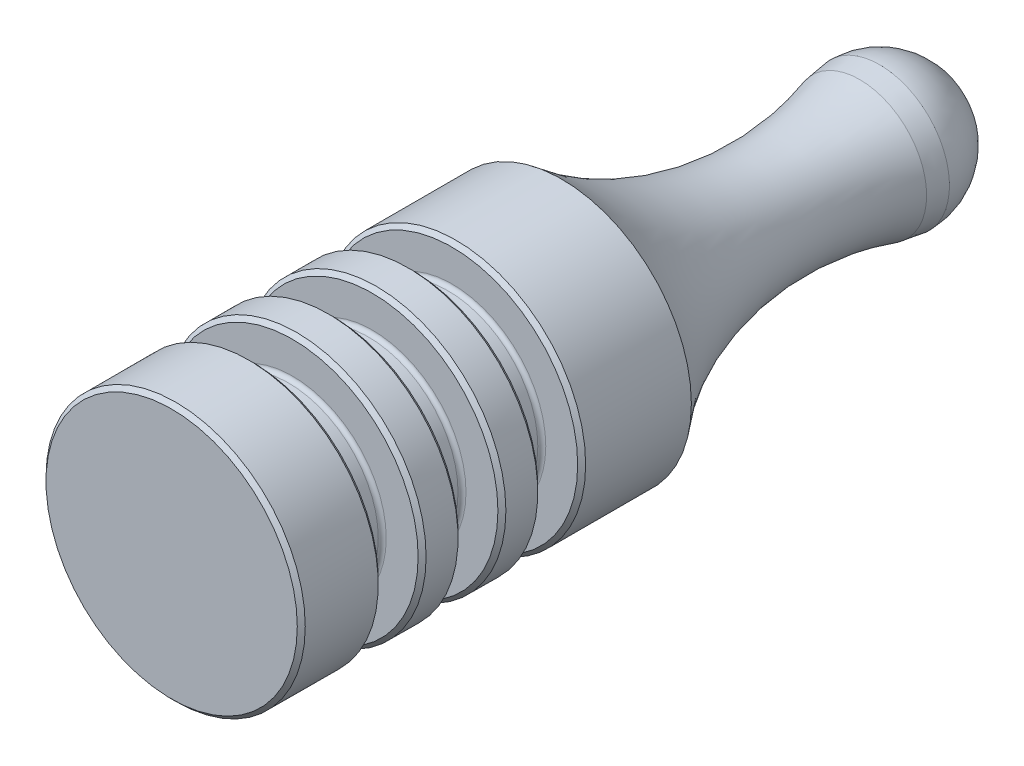
ISO-10303-21;
HEADER;
FILE_DESCRIPTION(('STEP AP214'),'2;1');
FILE_NAME('part.step','',(''),(''),'','','');
FILE_SCHEMA(('AUTOMOTIVE_DESIGN { 1 0 10303 214 1 1 1 1 }'));
ENDSEC;
DATA;
#1=APPLICATION_CONTEXT('core data for automotive mechanical design processes');
#2=APPLICATION_PROTOCOL_DEFINITION('international standard','automotive_design',2000,#1);
#3=PRODUCT_CONTEXT('',#1,'mechanical');
#4=PRODUCT('Part','Part','',(#3));
#5=PRODUCT_RELATED_PRODUCT_CATEGORY('part','',(#4));
#6=PRODUCT_DEFINITION_FORMATION('','',#4);
#7=PRODUCT_DEFINITION_CONTEXT('part definition',#1,'design');
#8=PRODUCT_DEFINITION('design','',#6,#7);
#9=PRODUCT_DEFINITION_SHAPE('','',#8);
#10=(LENGTH_UNIT() NAMED_UNIT(*) SI_UNIT(.MILLI.,.METRE.));
#11=(NAMED_UNIT(*) PLANE_ANGLE_UNIT() SI_UNIT($,.RADIAN.));
#12=(NAMED_UNIT(*) SI_UNIT($,.STERADIAN.) SOLID_ANGLE_UNIT());
#13=UNCERTAINTY_MEASURE_WITH_UNIT(LENGTH_MEASURE(1.E-05),#10,'distance_accuracy_value','');
#14=(GEOMETRIC_REPRESENTATION_CONTEXT(3) GLOBAL_UNCERTAINTY_ASSIGNED_CONTEXT((#13)) GLOBAL_UNIT_ASSIGNED_CONTEXT((#10,
#11,#12)) REPRESENTATION_CONTEXT('',''));
#15=CARTESIAN_POINT('',(0.,0.,0.));
#16=DIRECTION('',(0.,0.,1.));
#17=DIRECTION('',(1.,0.,0.));
#18=AXIS2_PLACEMENT_3D('',#15,#16,#17);
#19=CARTESIAN_POINT('',(0.,0.,35.5));
#20=DIRECTION('',(0.,0.,-1.));
#21=DIRECTION('',(-1.,0.,0.));
#22=AXIS2_PLACEMENT_3D('',#19,#20,#21);
#23=CYLINDRICAL_SURFACE('',#22,6.5);
#24=CARTESIAN_POINT('',(0.,0.,21.24));
#25=DIRECTION('',(0.,0.,1.));
#26=DIRECTION('',(1.,0.,0.));
#27=AXIS2_PLACEMENT_3D('',#24,#25,#26);
#28=CIRCLE('',#27,6.5);
#29=CARTESIAN_POINT('',(6.5,0.,21.24));
#30=VERTEX_POINT('',#29);
#31=EDGE_CURVE('E123',#30,#30,#28,.F.);
#32=ORIENTED_EDGE('',*,*,#31,.T.);
#33=EDGE_LOOP('',(#32));
#34=FACE_BOUND('',#33,.T.);
#35=CARTESIAN_POINT('',(0.,0.,15.94));
#36=DIRECTION('',(0.,0.,1.));
#37=DIRECTION('',(1.,0.,0.));
#38=AXIS2_PLACEMENT_3D('',#35,#36,#37);
#39=CIRCLE('',#38,6.5);
#40=CARTESIAN_POINT('',(6.5,0.,15.94));
#41=VERTEX_POINT('',#40);
#42=EDGE_CURVE('E132',#41,#41,#39,.T.);
#43=ORIENTED_EDGE('',*,*,#42,.T.);
#44=EDGE_LOOP('',(#43));
#45=FACE_BOUND('',#44,.T.);
#46=ADVANCED_FACE('F42',(#34,#45),#23,.T.);
#47=CARTESIAN_POINT('',(0.,0.,31.64));
#48=DIRECTION('',(0.,0.,-1.));
#49=DIRECTION('',(-1.,0.,0.));
#50=AXIS2_PLACEMENT_3D('',#47,#48,#49);
#51=CIRCLE('',#50,6.5);
#52=CARTESIAN_POINT('',(-6.5,0.,31.64));
#53=VERTEX_POINT('',#52);
#54=EDGE_CURVE('E92',#53,#53,#51,.F.);
#55=ORIENTED_EDGE('',*,*,#54,.T.);
#56=EDGE_LOOP('',(#55));
#57=FACE_BOUND('',#56,.T.);
#58=CARTESIAN_POINT('',(0.,0.,35.3));
#59=DIRECTION('',(0.,0.,1.));
#60=DIRECTION('',(1.,0.,0.));
#61=AXIS2_PLACEMENT_3D('',#58,#59,#60);
#62=CIRCLE('',#61,6.5);
#63=CARTESIAN_POINT('',(6.5,0.,35.3));
#64=VERTEX_POINT('',#63);
#65=EDGE_CURVE('E95',#64,#64,#62,.F.);
#66=ORIENTED_EDGE('',*,*,#65,.T.);
#67=EDGE_LOOP('',(#66));
#68=FACE_BOUND('',#67,.T.);
#69=ADVANCED_FACE('F155',(#57,#68),#23,.T.);
#70=CARTESIAN_POINT('',(0.,0.,35.5));
#71=DIRECTION('',(0.,0.,1.));
#72=DIRECTION('',(1.,0.,0.));
#73=AXIS2_PLACEMENT_3D('',#70,#71,#72);
#74=PLANE('',#73);
#75=CARTESIAN_POINT('',(0.,0.,35.5));
#76=DIRECTION('',(0.,0.,1.));
#77=DIRECTION('',(1.,0.,0.));
#78=AXIS2_PLACEMENT_3D('',#75,#76,#77);
#79=CIRCLE('',#78,6.3);
#80=CARTESIAN_POINT('',(6.3,0.,35.5));
#81=VERTEX_POINT('',#80);
#82=EDGE_CURVE('E86',#81,#81,#79,.T.);
#83=ORIENTED_EDGE('',*,*,#82,.T.);
#84=EDGE_LOOP('',(#83));
#85=FACE_BOUND('',#84,.T.);
#86=ADVANCED_FACE('F162',(#85),#74,.T.);
#87=CARTESIAN_POINT('',(0.,6.5,31.44));
#88=DIRECTION('',(0.,0.,-1.));
#89=DIRECTION('',(-1.,0.,0.));
#90=AXIS2_PLACEMENT_3D('',#87,#88,#89);
#91=PLANE('',#90);
#92=CARTESIAN_POINT('',(0.,0.,31.44));
#93=DIRECTION('',(0.,0.,-1.));
#94=DIRECTION('',(-1.,0.,0.));
#95=AXIS2_PLACEMENT_3D('',#92,#93,#94);
#96=CIRCLE('',#95,4.7);
#97=CARTESIAN_POINT('',(-4.7,0.,31.44));
#98=VERTEX_POINT('',#97);
#99=EDGE_CURVE('E10',#98,#98,#96,.F.);
#100=ORIENTED_EDGE('',*,*,#99,.T.);
#101=EDGE_LOOP('',(#100));
#102=FACE_BOUND('',#101,.T.);
#103=CARTESIAN_POINT('',(0.,0.,31.44));
#104=DIRECTION('',(0.,0.,-1.));
#105=DIRECTION('',(-1.,0.,0.));
#106=AXIS2_PLACEMENT_3D('',#103,#104,#105);
#107=CIRCLE('',#106,6.3);
#108=CARTESIAN_POINT('',(-6.3,0.,31.44));
#109=VERTEX_POINT('',#108);
#110=EDGE_CURVE('E89',#109,#109,#107,.T.);
#111=ORIENTED_EDGE('',*,*,#110,.T.);
#112=EDGE_LOOP('',(#111));
#113=FACE_BOUND('',#112,.T.);
#114=ADVANCED_FACE('F266',(#102,#113),#91,.T.);
#115=CARTESIAN_POINT('',(0.,0.,35.5));
#116=DIRECTION('',(0.,0.,1.));
#117=DIRECTION('',(1.,0.,0.));
#118=AXIS2_PLACEMENT_3D('',#115,#116,#117);
#119=CYLINDRICAL_SURFACE('',#118,4.5);
#120=CARTESIAN_POINT('',(0.,0.,29.64));
#121=DIRECTION('',(0.,0.,1.));
#122=DIRECTION('',(1.,0.,0.));
#123=AXIS2_PLACEMENT_3D('',#120,#121,#122);
#124=CIRCLE('',#123,4.5);
#125=CARTESIAN_POINT('',(4.5,0.,29.64));
#126=VERTEX_POINT('',#125);
#127=EDGE_CURVE('E62',#126,#126,#124,.T.);
#128=ORIENTED_EDGE('',*,*,#127,.T.);
#129=EDGE_LOOP('',(#128));
#130=FACE_BOUND('',#129,.T.);
#131=CARTESIAN_POINT('',(0.,0.,31.24));
#132=DIRECTION('',(0.,0.,-1.));
#133=DIRECTION('',(-1.,0.,0.));
#134=AXIS2_PLACEMENT_3D('',#131,#132,#133);
#135=CIRCLE('',#134,4.5);
#136=CARTESIAN_POINT('',(-4.5,0.,31.24));
#137=VERTEX_POINT('',#136);
#138=EDGE_CURVE('E65',#137,#137,#135,.T.);
#139=ORIENTED_EDGE('',*,*,#138,.T.);
#140=EDGE_LOOP('',(#139));
#141=FACE_BOUND('',#140,.T.);
#142=ADVANCED_FACE('F177',(#130,#141),#119,.T.);
#143=CARTESIAN_POINT('',(0.,6.5,29.44));
#144=DIRECTION('',(0.,0.,1.));
#145=DIRECTION('',(1.,0.,0.));
#146=AXIS2_PLACEMENT_3D('',#143,#144,#145);
#147=PLANE('',#146);
#148=CARTESIAN_POINT('',(0.,0.,29.44));
#149=DIRECTION('',(0.,0.,1.));
#150=DIRECTION('',(1.,0.,0.));
#151=AXIS2_PLACEMENT_3D('',#148,#149,#150);
#152=CIRCLE('',#151,4.7);
#153=CARTESIAN_POINT('',(4.7,0.,29.44));
#154=VERTEX_POINT('',#153);
#155=EDGE_CURVE('E57',#154,#154,#152,.F.);
#156=ORIENTED_EDGE('',*,*,#155,.T.);
#157=EDGE_LOOP('',(#156));
#158=FACE_BOUND('',#157,.T.);
#159=CARTESIAN_POINT('',(0.,0.,29.44));
#160=DIRECTION('',(0.,0.,1.));
#161=DIRECTION('',(1.,0.,0.));
#162=AXIS2_PLACEMENT_3D('',#159,#160,#161);
#163=CIRCLE('',#162,6.3);
#164=CARTESIAN_POINT('',(6.3,0.,29.44));
#165=VERTEX_POINT('',#164);
#166=EDGE_CURVE('E99',#165,#165,#163,.T.);
#167=ORIENTED_EDGE('',*,*,#166,.T.);
#168=EDGE_LOOP('',(#167));
#169=FACE_BOUND('',#168,.T.);
#170=ADVANCED_FACE('F169',(#158,#169),#147,.T.);
#171=CARTESIAN_POINT('',(0.,0.,27.64));
#172=DIRECTION('',(0.,0.,-1.));
#173=DIRECTION('',(-1.,0.,0.));
#174=AXIS2_PLACEMENT_3D('',#171,#172,#173);
#175=CIRCLE('',#174,6.5);
#176=CARTESIAN_POINT('',(-6.5,0.,27.64));
#177=VERTEX_POINT('',#176);
#178=EDGE_CURVE('E105',#177,#177,#175,.F.);
#179=ORIENTED_EDGE('',*,*,#178,.T.);
#180=EDGE_LOOP('',(#179));
#181=FACE_BOUND('',#180,.T.);
#182=CARTESIAN_POINT('',(0.,0.,29.24));
#183=DIRECTION('',(0.,0.,1.));
#184=DIRECTION('',(1.,0.,0.));
#185=AXIS2_PLACEMENT_3D('',#182,#183,#184);
#186=CIRCLE('',#185,6.5);
#187=CARTESIAN_POINT('',(6.5,0.,29.24));
#188=VERTEX_POINT('',#187);
#189=EDGE_CURVE('E108',#188,#188,#186,.F.);
#190=ORIENTED_EDGE('',*,*,#189,.T.);
#191=EDGE_LOOP('',(#190));
#192=FACE_BOUND('',#191,.T.);
#193=ADVANCED_FACE('F158',(#181,#192),#23,.T.);
#194=CARTESIAN_POINT('',(0.,6.5,27.44));
#195=DIRECTION('',(0.,0.,-1.));
#196=DIRECTION('',(-1.,0.,0.));
#197=AXIS2_PLACEMENT_3D('',#194,#195,#196);
#198=PLANE('',#197);
#199=CARTESIAN_POINT('',(0.,0.,27.44));
#200=DIRECTION('',(0.,0.,-1.));
#201=DIRECTION('',(-1.,0.,0.));
#202=AXIS2_PLACEMENT_3D('',#199,#200,#201);
#203=CIRCLE('',#202,4.7);
#204=CARTESIAN_POINT('',(-4.7,0.,27.44));
#205=VERTEX_POINT('',#204);
#206=EDGE_CURVE('E49',#205,#205,#203,.F.);
#207=ORIENTED_EDGE('',*,*,#206,.T.);
#208=EDGE_LOOP('',(#207));
#209=FACE_BOUND('',#208,.T.);
#210=CARTESIAN_POINT('',(0.,0.,27.44));
#211=DIRECTION('',(0.,0.,-1.));
#212=DIRECTION('',(-1.,0.,0.));
#213=AXIS2_PLACEMENT_3D('',#210,#211,#212);
#214=CIRCLE('',#213,6.3);
#215=CARTESIAN_POINT('',(-6.3,0.,27.44));
#216=VERTEX_POINT('',#215);
#217=EDGE_CURVE('E102',#216,#216,#214,.T.);
#218=ORIENTED_EDGE('',*,*,#217,.T.);
#219=EDGE_LOOP('',(#218));
#220=FACE_BOUND('',#219,.T.);
#221=ADVANCED_FACE('F168',(#209,#220),#198,.T.);
#222=CARTESIAN_POINT('',(0.,0.,35.5));
#223=DIRECTION('',(0.,0.,1.));
#224=DIRECTION('',(1.,0.,0.));
#225=AXIS2_PLACEMENT_3D('',#222,#223,#224);
#226=CYLINDRICAL_SURFACE('',#225,4.5);
#227=CARTESIAN_POINT('',(0.,0.,25.64));
#228=DIRECTION('',(0.,0.,1.));
#229=DIRECTION('',(1.,0.,0.));
#230=AXIS2_PLACEMENT_3D('',#227,#228,#229);
#231=CIRCLE('',#230,4.5);
#232=CARTESIAN_POINT('',(4.5,0.,25.64));
#233=VERTEX_POINT('',#232);
#234=EDGE_CURVE('E71',#233,#233,#231,.T.);
#235=ORIENTED_EDGE('',*,*,#234,.T.);
#236=EDGE_LOOP('',(#235));
#237=FACE_BOUND('',#236,.T.);
#238=CARTESIAN_POINT('',(0.,0.,27.24));
#239=DIRECTION('',(0.,0.,-1.));
#240=DIRECTION('',(-1.,0.,0.));
#241=AXIS2_PLACEMENT_3D('',#238,#239,#240);
#242=CIRCLE('',#241,4.5);
#243=CARTESIAN_POINT('',(-4.5,0.,27.24));
#244=VERTEX_POINT('',#243);
#245=EDGE_CURVE('E74',#244,#244,#242,.T.);
#246=ORIENTED_EDGE('',*,*,#245,.T.);
#247=EDGE_LOOP('',(#246));
#248=FACE_BOUND('',#247,.T.);
#249=ADVANCED_FACE('F175',(#237,#248),#226,.T.);
#250=CARTESIAN_POINT('',(0.,6.5,25.44));
#251=DIRECTION('',(0.,0.,1.));
#252=DIRECTION('',(1.,0.,0.));
#253=AXIS2_PLACEMENT_3D('',#250,#251,#252);
#254=PLANE('',#253);
#255=CARTESIAN_POINT('',(0.,0.,25.44));
#256=DIRECTION('',(0.,0.,1.));
#257=DIRECTION('',(1.,0.,0.));
#258=AXIS2_PLACEMENT_3D('',#255,#256,#257);
#259=CIRCLE('',#258,4.7);
#260=CARTESIAN_POINT('',(4.7,0.,25.44));
#261=VERTEX_POINT('',#260);
#262=EDGE_CURVE('E68',#261,#261,#259,.F.);
#263=ORIENTED_EDGE('',*,*,#262,.T.);
#264=EDGE_LOOP('',(#263));
#265=FACE_BOUND('',#264,.T.);
#266=CARTESIAN_POINT('',(0.,0.,25.44));
#267=DIRECTION('',(0.,0.,1.));
#268=DIRECTION('',(1.,0.,0.));
#269=AXIS2_PLACEMENT_3D('',#266,#267,#268);
#270=CIRCLE('',#269,6.3);
#271=CARTESIAN_POINT('',(6.3,0.,25.44));
#272=VERTEX_POINT('',#271);
#273=EDGE_CURVE('E111',#272,#272,#270,.T.);
#274=ORIENTED_EDGE('',*,*,#273,.T.);
#275=EDGE_LOOP('',(#274));
#276=FACE_BOUND('',#275,.T.);
#277=ADVANCED_FACE('F183',(#265,#276),#254,.T.);
#278=CARTESIAN_POINT('',(0.,0.,23.64));
#279=DIRECTION('',(0.,0.,-1.));
#280=DIRECTION('',(-1.,0.,0.));
#281=AXIS2_PLACEMENT_3D('',#278,#279,#280);
#282=CIRCLE('',#281,6.5);
#283=CARTESIAN_POINT('',(-6.5,0.,23.64));
#284=VERTEX_POINT('',#283);
#285=EDGE_CURVE('E117',#284,#284,#282,.F.);
#286=ORIENTED_EDGE('',*,*,#285,.T.);
#287=EDGE_LOOP('',(#286));
#288=FACE_BOUND('',#287,.T.);
#289=CARTESIAN_POINT('',(0.,0.,25.24));
#290=DIRECTION('',(0.,0.,1.));
#291=DIRECTION('',(1.,0.,0.));
#292=AXIS2_PLACEMENT_3D('',#289,#290,#291);
#293=CIRCLE('',#292,6.5);
#294=CARTESIAN_POINT('',(6.5,0.,25.24));
#295=VERTEX_POINT('',#294);
#296=EDGE_CURVE('E120',#295,#295,#293,.F.);
#297=ORIENTED_EDGE('',*,*,#296,.T.);
#298=EDGE_LOOP('',(#297));
#299=FACE_BOUND('',#298,.T.);
#300=ADVANCED_FACE('F164',(#288,#299),#23,.T.);
#301=CARTESIAN_POINT('',(0.,6.5,23.44));
#302=DIRECTION('',(0.,0.,-1.));
#303=DIRECTION('',(-1.,0.,0.));
#304=AXIS2_PLACEMENT_3D('',#301,#302,#303);
#305=PLANE('',#304);
#306=CARTESIAN_POINT('',(0.,0.,23.44));
#307=DIRECTION('',(0.,0.,-1.));
#308=DIRECTION('',(-1.,0.,0.));
#309=AXIS2_PLACEMENT_3D('',#306,#307,#308);
#310=CIRCLE('',#309,4.7);
#311=CARTESIAN_POINT('',(-4.7,0.,23.44));
#312=VERTEX_POINT('',#311);
#313=EDGE_CURVE('E53',#312,#312,#310,.F.);
#314=ORIENTED_EDGE('',*,*,#313,.T.);
#315=EDGE_LOOP('',(#314));
#316=FACE_BOUND('',#315,.T.);
#317=CARTESIAN_POINT('',(0.,0.,23.44));
#318=DIRECTION('',(0.,0.,-1.));
#319=DIRECTION('',(-1.,0.,0.));
#320=AXIS2_PLACEMENT_3D('',#317,#318,#319);
#321=CIRCLE('',#320,6.3);
#322=CARTESIAN_POINT('',(-6.3,0.,23.44));
#323=VERTEX_POINT('',#322);
#324=EDGE_CURVE('E114',#323,#323,#321,.T.);
#325=ORIENTED_EDGE('',*,*,#324,.T.);
#326=EDGE_LOOP('',(#325));
#327=FACE_BOUND('',#326,.T.);
#328=ADVANCED_FACE('F182',(#316,#327),#305,.T.);
#329=CARTESIAN_POINT('',(0.,0.,35.5));
#330=DIRECTION('',(0.,0.,1.));
#331=DIRECTION('',(1.,0.,0.));
#332=AXIS2_PLACEMENT_3D('',#329,#330,#331);
#333=CYLINDRICAL_SURFACE('',#332,4.5);
#334=CARTESIAN_POINT('',(0.,0.,21.64));
#335=DIRECTION('',(0.,0.,1.));
#336=DIRECTION('',(1.,0.,0.));
#337=AXIS2_PLACEMENT_3D('',#334,#335,#336);
#338=CIRCLE('',#337,4.5);
#339=CARTESIAN_POINT('',(4.5,0.,21.64));
#340=VERTEX_POINT('',#339);
#341=EDGE_CURVE('E80',#340,#340,#338,.T.);
#342=ORIENTED_EDGE('',*,*,#341,.T.);
#343=EDGE_LOOP('',(#342));
#344=FACE_BOUND('',#343,.T.);
#345=CARTESIAN_POINT('',(0.,0.,23.24));
#346=DIRECTION('',(0.,0.,-1.));
#347=DIRECTION('',(-1.,0.,0.));
#348=AXIS2_PLACEMENT_3D('',#345,#346,#347);
#349=CIRCLE('',#348,4.5);
#350=CARTESIAN_POINT('',(-4.5,0.,23.24));
#351=VERTEX_POINT('',#350);
#352=EDGE_CURVE('E83',#351,#351,#349,.T.);
#353=ORIENTED_EDGE('',*,*,#352,.T.);
#354=EDGE_LOOP('',(#353));
#355=FACE_BOUND('',#354,.T.);
#356=ADVANCED_FACE('F189',(#344,#355),#333,.T.);
#357=CARTESIAN_POINT('',(0.,6.5,21.44));
#358=DIRECTION('',(0.,0.,1.));
#359=DIRECTION('',(1.,0.,0.));
#360=AXIS2_PLACEMENT_3D('',#357,#358,#359);
#361=PLANE('',#360);
#362=CARTESIAN_POINT('',(0.,0.,21.44));
#363=DIRECTION('',(0.,0.,1.));
#364=DIRECTION('',(1.,0.,0.));
#365=AXIS2_PLACEMENT_3D('',#362,#363,#364);
#366=CIRCLE('',#365,4.7);
#367=CARTESIAN_POINT('',(4.7,0.,21.44));
#368=VERTEX_POINT('',#367);
#369=EDGE_CURVE('E77',#368,#368,#366,.F.);
#370=ORIENTED_EDGE('',*,*,#369,.T.);
#371=EDGE_LOOP('',(#370));
#372=FACE_BOUND('',#371,.T.);
#373=CARTESIAN_POINT('',(0.,0.,21.44));
#374=DIRECTION('',(0.,0.,1.));
#375=DIRECTION('',(1.,0.,0.));
#376=AXIS2_PLACEMENT_3D('',#373,#374,#375);
#377=CIRCLE('',#376,6.3);
#378=CARTESIAN_POINT('',(6.3,0.,21.44));
#379=VERTEX_POINT('',#378);
#380=EDGE_CURVE('E126',#379,#379,#377,.T.);
#381=ORIENTED_EDGE('',*,*,#380,.T.);
#382=EDGE_LOOP('',(#381));
#383=FACE_BOUND('',#382,.T.);
#384=ADVANCED_FACE('F150',(#372,#383),#361,.T.);
#385=CARTESIAN_POINT('',(0.,0.,5.57341159366133));
#386=DIRECTION('',(0.,0.,1.));
#387=DIRECTION('',(1.,0.,0.));
#388=AXIS2_PLACEMENT_3D('',#385,#386,#387);
#389=TOROIDAL_SURFACE('',#388,18.6874461973608,16.);
#390=CARTESIAN_POINT('',(0.,0.,1.));
#391=DIRECTION('',(0.,0.,1.));
#392=DIRECTION('',(1.,0.,0.));
#393=AXIS2_PLACEMENT_3D('',#390,#391,#392);
#394=CIRCLE('',#393,3.355);
#395=CARTESIAN_POINT('',(3.355,0.,1.));
#396=VERTEX_POINT('',#395);
#397=EDGE_CURVE('E129',#396,#396,#394,.T.);
#398=ORIENTED_EDGE('',*,*,#397,.T.);
#399=EDGE_LOOP('',(#398));
#400=FACE_BOUND('',#399,.T.);
#401=ORIENTED_EDGE('',*,*,#42,.F.);
#402=EDGE_LOOP('',(#401));
#403=FACE_BOUND('',#402,.T.);
#404=ADVANCED_FACE('F144',(#400,#403),#389,.F.);
#405=CARTESIAN_POINT('',(0.,0.,1.));
#406=DIRECTION('',(0.,0.,-1.));
#407=DIRECTION('',(-1.,0.,0.));
#408=AXIS2_PLACEMENT_3D('',#405,#406,#407);
#409=CONICAL_SURFACE('',#408,3.355,0.143996421708892);
#410=CARTESIAN_POINT('',(0.,0.,0.));
#411=DIRECTION('',(0.,0.,-1.));
#412=DIRECTION('',(-1.,0.,0.));
#413=AXIS2_PLACEMENT_3D('',#410,#411,#412);
#414=CIRCLE('',#413,3.5);
#415=CARTESIAN_POINT('',(-3.5,0.,0.));
#416=VERTEX_POINT('',#415);
#417=EDGE_CURVE('E135',#416,#416,#414,.T.);
#418=ORIENTED_EDGE('',*,*,#417,.F.);
#419=EDGE_LOOP('',(#418));
#420=FACE_BOUND('',#419,.T.);
#421=ORIENTED_EDGE('',*,*,#397,.F.);
#422=EDGE_LOOP('',(#421));
#423=FACE_BOUND('',#422,.T.);
#424=ADVANCED_FACE('F141',(#420,#423),#409,.T.);
#425=CARTESIAN_POINT('',(0.,0.,0.));
#426=DIRECTION('',(0.,0.,-1.));
#427=DIRECTION('',(0.,-1.,0.));
#428=AXIS2_PLACEMENT_3D('',#425,#426,#427);
#429=SPHERICAL_SURFACE('',#428,3.5);
#430=ORIENTED_EDGE('',*,*,#417,.T.);
#431=EDGE_LOOP('',(#430));
#432=FACE_BOUND('',#431,.T.);
#433=ADVANCED_FACE('F139',(#432),#429,.T.);
#434=CARTESIAN_POINT('',(0.,0.,21.44));
#435=DIRECTION('',(0.,0.,-1.));
#436=DIRECTION('',(-1.,0.,0.));
#437=AXIS2_PLACEMENT_3D('',#434,#435,#436);
#438=CONICAL_SURFACE('',#437,6.3,0.785398163397446);
#439=ORIENTED_EDGE('',*,*,#31,.F.);
#440=EDGE_LOOP('',(#439));
#441=FACE_BOUND('',#440,.T.);
#442=ORIENTED_EDGE('',*,*,#380,.F.);
#443=EDGE_LOOP('',(#442));
#444=FACE_BOUND('',#443,.T.);
#445=ADVANCED_FACE('F213',(#441,#444),#438,.T.);
#446=CARTESIAN_POINT('',(0.,0.,23.64));
#447=DIRECTION('',(0.,0.,1.));
#448=DIRECTION('',(1.,0.,0.));
#449=AXIS2_PLACEMENT_3D('',#446,#447,#448);
#450=CONICAL_SURFACE('',#449,6.5,0.785398163397446);
#451=ORIENTED_EDGE('',*,*,#324,.F.);
#452=EDGE_LOOP('',(#451));
#453=FACE_BOUND('',#452,.T.);
#454=ORIENTED_EDGE('',*,*,#285,.F.);
#455=EDGE_LOOP('',(#454));
#456=FACE_BOUND('',#455,.T.);
#457=ADVANCED_FACE('F202',(#453,#456),#450,.T.);
#458=CARTESIAN_POINT('',(0.,0.,25.44));
#459=DIRECTION('',(0.,0.,-1.));
#460=DIRECTION('',(-1.,0.,0.));
#461=AXIS2_PLACEMENT_3D('',#458,#459,#460);
#462=CONICAL_SURFACE('',#461,6.3,0.785398163397446);
#463=ORIENTED_EDGE('',*,*,#296,.F.);
#464=EDGE_LOOP('',(#463));
#465=FACE_BOUND('',#464,.T.);
#466=ORIENTED_EDGE('',*,*,#273,.F.);
#467=EDGE_LOOP('',(#466));
#468=FACE_BOUND('',#467,.T.);
#469=ADVANCED_FACE('F198',(#465,#468),#462,.T.);
#470=CARTESIAN_POINT('',(0.,0.,27.64));
#471=DIRECTION('',(0.,0.,1.));
#472=DIRECTION('',(1.,0.,0.));
#473=AXIS2_PLACEMENT_3D('',#470,#471,#472);
#474=CONICAL_SURFACE('',#473,6.5,0.785398163397446);
#475=ORIENTED_EDGE('',*,*,#217,.F.);
#476=EDGE_LOOP('',(#475));
#477=FACE_BOUND('',#476,.T.);
#478=ORIENTED_EDGE('',*,*,#178,.F.);
#479=EDGE_LOOP('',(#478));
#480=FACE_BOUND('',#479,.T.);
#481=ADVANCED_FACE('F201',(#477,#480),#474,.T.);
#482=CARTESIAN_POINT('',(0.,0.,29.44));
#483=DIRECTION('',(0.,0.,-1.));
#484=DIRECTION('',(-1.,0.,0.));
#485=AXIS2_PLACEMENT_3D('',#482,#483,#484);
#486=CONICAL_SURFACE('',#485,6.3,0.785398163397446);
#487=ORIENTED_EDGE('',*,*,#189,.F.);
#488=EDGE_LOOP('',(#487));
#489=FACE_BOUND('',#488,.T.);
#490=ORIENTED_EDGE('',*,*,#166,.F.);
#491=EDGE_LOOP('',(#490));
#492=FACE_BOUND('',#491,.T.);
#493=ADVANCED_FACE('F210',(#489,#492),#486,.T.);
#494=CARTESIAN_POINT('',(0.,0.,31.64));
#495=DIRECTION('',(0.,0.,1.));
#496=DIRECTION('',(1.,0.,0.));
#497=AXIS2_PLACEMENT_3D('',#494,#495,#496);
#498=CONICAL_SURFACE('',#497,6.5,0.785398163397446);
#499=ORIENTED_EDGE('',*,*,#110,.F.);
#500=EDGE_LOOP('',(#499));
#501=FACE_BOUND('',#500,.T.);
#502=ORIENTED_EDGE('',*,*,#54,.F.);
#503=EDGE_LOOP('',(#502));
#504=FACE_BOUND('',#503,.T.);
#505=ADVANCED_FACE('F219',(#501,#504),#498,.T.);
#506=CARTESIAN_POINT('',(0.,0.,35.5));
#507=DIRECTION('',(0.,0.,-1.));
#508=DIRECTION('',(-1.,0.,0.));
#509=AXIS2_PLACEMENT_3D('',#506,#507,#508);
#510=CONICAL_SURFACE('',#509,6.3,0.785398163397446);
#511=ORIENTED_EDGE('',*,*,#65,.F.);
#512=EDGE_LOOP('',(#511));
#513=FACE_BOUND('',#512,.T.);
#514=ORIENTED_EDGE('',*,*,#82,.F.);
#515=EDGE_LOOP('',(#514));
#516=FACE_BOUND('',#515,.T.);
#517=ADVANCED_FACE('F223',(#513,#516),#510,.T.);
#518=CARTESIAN_POINT('',(0.,0.,21.64));
#519=DIRECTION('',(0.,0.,1.));
#520=DIRECTION('',(1.,0.,0.));
#521=AXIS2_PLACEMENT_3D('',#518,#519,#520);
#522=TOROIDAL_SURFACE('',#521,4.7,0.2);
#523=ORIENTED_EDGE('',*,*,#369,.F.);
#524=EDGE_LOOP('',(#523));
#525=FACE_BOUND('',#524,.T.);
#526=ORIENTED_EDGE('',*,*,#341,.F.);
#527=EDGE_LOOP('',(#526));
#528=FACE_BOUND('',#527,.T.);
#529=ADVANCED_FACE('F227',(#525,#528),#522,.F.);
#530=CARTESIAN_POINT('',(0.,0.,25.64));
#531=DIRECTION('',(0.,0.,1.));
#532=DIRECTION('',(1.,0.,0.));
#533=AXIS2_PLACEMENT_3D('',#530,#531,#532);
#534=TOROIDAL_SURFACE('',#533,4.7,0.2);
#535=ORIENTED_EDGE('',*,*,#262,.F.);
#536=EDGE_LOOP('',(#535));
#537=FACE_BOUND('',#536,.T.);
#538=ORIENTED_EDGE('',*,*,#234,.F.);
#539=EDGE_LOOP('',(#538));
#540=FACE_BOUND('',#539,.T.);
#541=ADVANCED_FACE('F231',(#537,#540),#534,.F.);
#542=CARTESIAN_POINT('',(0.,0.,29.64));
#543=DIRECTION('',(0.,0.,1.));
#544=DIRECTION('',(1.,0.,0.));
#545=AXIS2_PLACEMENT_3D('',#542,#543,#544);
#546=TOROIDAL_SURFACE('',#545,4.7,0.2);
#547=ORIENTED_EDGE('',*,*,#155,.F.);
#548=EDGE_LOOP('',(#547));
#549=FACE_BOUND('',#548,.T.);
#550=ORIENTED_EDGE('',*,*,#127,.F.);
#551=EDGE_LOOP('',(#550));
#552=FACE_BOUND('',#551,.T.);
#553=ADVANCED_FACE('F235',(#549,#552),#546,.F.);
#554=CARTESIAN_POINT('',(0.,0.,23.24));
#555=DIRECTION('',(0.,0.,-1.));
#556=DIRECTION('',(-1.,0.,0.));
#557=AXIS2_PLACEMENT_3D('',#554,#555,#556);
#558=TOROIDAL_SURFACE('',#557,4.7,0.2);
#559=ORIENTED_EDGE('',*,*,#352,.F.);
#560=EDGE_LOOP('',(#559));
#561=FACE_BOUND('',#560,.T.);
#562=ORIENTED_EDGE('',*,*,#313,.F.);
#563=EDGE_LOOP('',(#562));
#564=FACE_BOUND('',#563,.T.);
#565=ADVANCED_FACE('F239',(#561,#564),#558,.F.);
#566=CARTESIAN_POINT('',(0.,0.,27.24));
#567=DIRECTION('',(0.,0.,-1.));
#568=DIRECTION('',(-1.,0.,0.));
#569=AXIS2_PLACEMENT_3D('',#566,#567,#568);
#570=TOROIDAL_SURFACE('',#569,4.7,0.2);
#571=ORIENTED_EDGE('',*,*,#245,.F.);
#572=EDGE_LOOP('',(#571));
#573=FACE_BOUND('',#572,.T.);
#574=ORIENTED_EDGE('',*,*,#206,.F.);
#575=EDGE_LOOP('',(#574));
#576=FACE_BOUND('',#575,.T.);
#577=ADVANCED_FACE('F242',(#573,#576),#570,.F.);
#578=CARTESIAN_POINT('',(0.,0.,31.24));
#579=DIRECTION('',(0.,0.,-1.));
#580=DIRECTION('',(-1.,0.,0.));
#581=AXIS2_PLACEMENT_3D('',#578,#579,#580);
#582=TOROIDAL_SURFACE('',#581,4.7,0.2);
#583=ORIENTED_EDGE('',*,*,#138,.F.);
#584=EDGE_LOOP('',(#583));
#585=FACE_BOUND('',#584,.T.);
#586=ORIENTED_EDGE('',*,*,#99,.F.);
#587=EDGE_LOOP('',(#586));
#588=FACE_BOUND('',#587,.T.);
#589=ADVANCED_FACE('F44',(#585,#588),#582,.F.);
#590=CLOSED_SHELL('',(#46,#69,#86,#114,#142,#170,#193,#221,#249,#277,#300,#328,#356,#384,#404,
#424,#433,#445,#457,#469,#481,#493,#505,#517,#529,#541,#553,#565,#577,#589));
#591=MANIFOLD_SOLID_BREP('B2',#590);
#592=ADVANCED_BREP_SHAPE_REPRESENTATION('',(#18,#591),#14);
#593=SHAPE_DEFINITION_REPRESENTATION(#9,#592);
ENDSEC;
END-ISO-10303-21;
